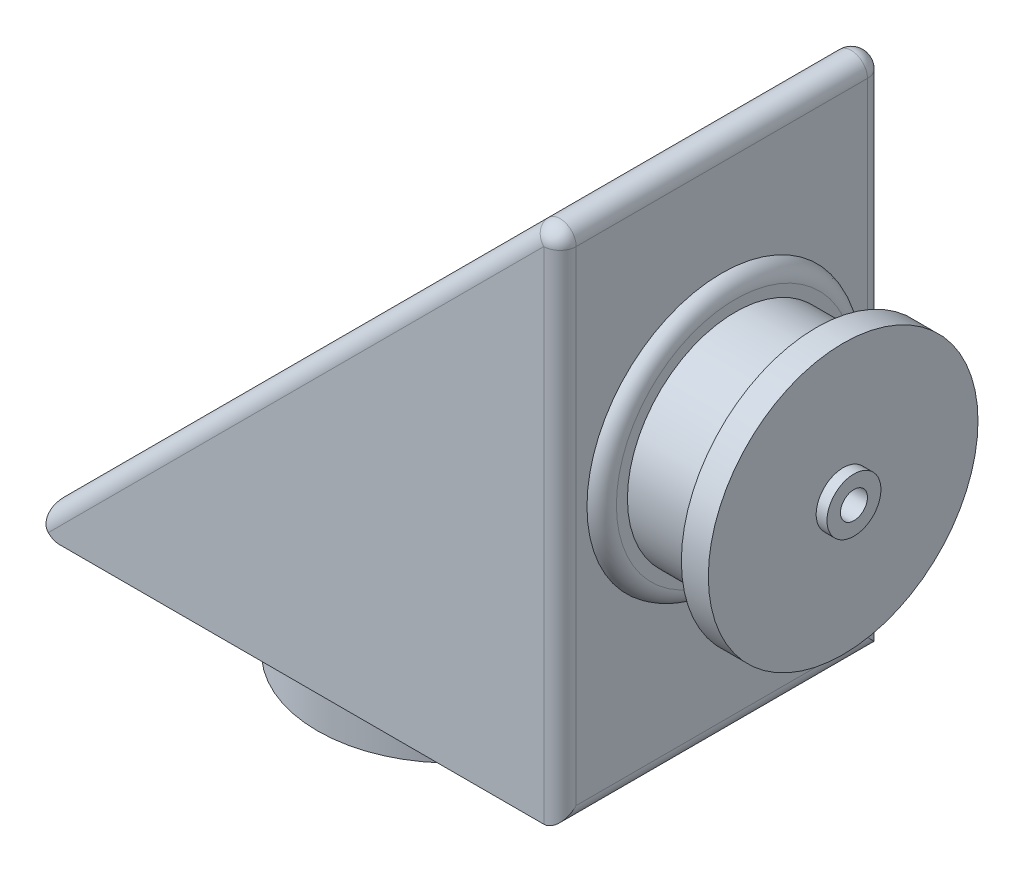
ISO-10303-21;
HEADER;
FILE_DESCRIPTION(('STEP AP214'),'2;1');
FILE_NAME('part.step','',(''),(''),'','','');
FILE_SCHEMA(('AUTOMOTIVE_DESIGN { 1 0 10303 214 1 1 1 1 }'));
ENDSEC;
DATA;
#1=APPLICATION_CONTEXT('core data for automotive mechanical design processes');
#2=APPLICATION_PROTOCOL_DEFINITION('international standard','automotive_design',2000,#1);
#3=PRODUCT_CONTEXT('',#1,'mechanical');
#4=PRODUCT('Part','Part','',(#3));
#5=PRODUCT_RELATED_PRODUCT_CATEGORY('part','',(#4));
#6=PRODUCT_DEFINITION_FORMATION('','',#4);
#7=PRODUCT_DEFINITION_CONTEXT('part definition',#1,'design');
#8=PRODUCT_DEFINITION('design','',#6,#7);
#9=PRODUCT_DEFINITION_SHAPE('','',#8);
#10=(LENGTH_UNIT() NAMED_UNIT(*) SI_UNIT(.MILLI.,.METRE.));
#11=(NAMED_UNIT(*) PLANE_ANGLE_UNIT() SI_UNIT($,.RADIAN.));
#12=(NAMED_UNIT(*) SI_UNIT($,.STERADIAN.) SOLID_ANGLE_UNIT());
#13=UNCERTAINTY_MEASURE_WITH_UNIT(LENGTH_MEASURE(1.E-05),#10,'distance_accuracy_value','');
#14=(GEOMETRIC_REPRESENTATION_CONTEXT(3) GLOBAL_UNCERTAINTY_ASSIGNED_CONTEXT((#13)) GLOBAL_UNIT_ASSIGNED_CONTEXT((#10,
#11,#12)) REPRESENTATION_CONTEXT('',''));
#15=CARTESIAN_POINT('',(0.,0.,0.));
#16=DIRECTION('',(0.,0.,1.));
#17=DIRECTION('',(1.,0.,0.));
#18=AXIS2_PLACEMENT_3D('',#15,#16,#17);
#19=CARTESIAN_POINT('',(100.,100.,30.));
#20=DIRECTION('',(0.707106781186547,-0.707106781186547,0.));
#21=DIRECTION('',(0.707106781186548,0.707106781186548,0.));
#22=AXIS2_PLACEMENT_3D('',#19,#20,#21);
#23=PLANE('',#22);
#24=DIRECTION('',(0.,0.,-1.));
#25=VECTOR('',#24,1.);
#26=CARTESIAN_POINT('',(94.8786796564404,94.8786796564404,30.));
#27=LINE('',#26,#25);
#28=CARTESIAN_POINT('',(94.8786796564404,94.8786796564404,27.));
#29=VERTEX_POINT('',#28);
#30=CARTESIAN_POINT('',(94.8786796564404,94.8786796564404,-27.));
#31=VERTEX_POINT('',#30);
#32=EDGE_CURVE('E258',#29,#31,#27,.T.);
#33=ORIENTED_EDGE('',*,*,#32,.T.);
#34=DIRECTION('',(-0.707106781186548,-0.707106781186548,0.));
#35=VECTOR('',#34,1.);
#36=CARTESIAN_POINT('',(100.,100.,-27.));
#37=LINE('',#36,#35);
#38=CARTESIAN_POINT('',(5.12132034355965,5.12132034355965,-27.));
#39=VERTEX_POINT('',#38);
#40=EDGE_CURVE('E65',#31,#39,#37,.T.);
#41=ORIENTED_EDGE('',*,*,#40,.T.);
#42=DIRECTION('',(0.,0.,-1.));
#43=VECTOR('',#42,1.);
#44=CARTESIAN_POINT('',(5.12132034355965,5.12132034355965,30.));
#45=LINE('',#44,#43);
#46=CARTESIAN_POINT('',(5.12132034355965,5.12132034355965,27.));
#47=VERTEX_POINT('',#46);
#48=EDGE_CURVE('E256',#39,#47,#45,.F.);
#49=ORIENTED_EDGE('',*,*,#48,.T.);
#50=DIRECTION('',(-0.707106781186548,-0.707106781186548,0.));
#51=VECTOR('',#50,1.);
#52=CARTESIAN_POINT('',(100.,100.,27.));
#53=LINE('',#52,#51);
#54=EDGE_CURVE('E254',#47,#29,#53,.F.);
#55=ORIENTED_EDGE('',*,*,#54,.T.);
#56=EDGE_LOOP('',(#33,#41,#49,#55));
#57=FACE_BOUND('',#56,.T.);
#58=ADVANCED_FACE('F41',(#57),#23,.F.);
#59=CARTESIAN_POINT('',(0.,0.,30.));
#60=DIRECTION('',(0.,1.,0.));
#61=DIRECTION('',(0.,0.,1.));
#62=AXIS2_PLACEMENT_3D('',#59,#60,#61);
#63=PLANE('',#62);
#64=CARTESIAN_POINT('',(50.,0.,0.));
#65=DIRECTION('',(0.,1.,0.));
#66=DIRECTION('',(0.,0.,1.));
#67=AXIS2_PLACEMENT_3D('',#64,#65,#66);
#68=CIRCLE('',#67,25.);
#69=CARTESIAN_POINT('',(50.,0.,25.));
#70=VERTEX_POINT('',#69);
#71=EDGE_CURVE('E158',#70,#70,#68,.F.);
#72=ORIENTED_EDGE('',*,*,#71,.F.);
#73=EDGE_LOOP('',(#72));
#74=FACE_BOUND('',#73,.T.);
#75=DIRECTION('',(1.,0.,0.));
#76=VECTOR('',#75,1.);
#77=CARTESIAN_POINT('',(0.,0.,-30.));
#78=LINE('',#77,#76);
#79=CARTESIAN_POINT('',(7.2426406871193,0.,-30.));
#80=VERTEX_POINT('',#79);
#81=CARTESIAN_POINT('',(97.,0.,-30.));
#82=VERTEX_POINT('',#81);
#83=EDGE_CURVE('E157',#80,#82,#78,.T.);
#84=ORIENTED_EDGE('',*,*,#83,.T.);
#85=DIRECTION('',(0.,0.,-1.));
#86=VECTOR('',#85,1.);
#87=CARTESIAN_POINT('',(97.,0.,30.));
#88=LINE('',#87,#86);
#89=CARTESIAN_POINT('',(97.,0.,30.));
#90=VERTEX_POINT('',#89);
#91=EDGE_CURVE('E239',#82,#90,#88,.F.);
#92=ORIENTED_EDGE('',*,*,#91,.T.);
#93=DIRECTION('',(1.,0.,0.));
#94=VECTOR('',#93,1.);
#95=CARTESIAN_POINT('',(0.,0.,30.));
#96=LINE('',#95,#94);
#97=CARTESIAN_POINT('',(7.2426406871193,0.,30.));
#98=VERTEX_POINT('',#97);
#99=EDGE_CURVE('E129',#98,#90,#96,.T.);
#100=ORIENTED_EDGE('',*,*,#99,.F.);
#101=DIRECTION('',(0.,0.,-1.));
#102=VECTOR('',#101,1.);
#103=CARTESIAN_POINT('',(7.2426406871193,0.,30.));
#104=LINE('',#103,#102);
#105=EDGE_CURVE('E230',#98,#80,#104,.T.);
#106=ORIENTED_EDGE('',*,*,#105,.T.);
#107=EDGE_LOOP('',(#84,#92,#100,#106));
#108=FACE_BOUND('',#107,.T.);
#109=ADVANCED_FACE('F182',(#74,#108),#63,.F.);
#110=CARTESIAN_POINT('',(100.,0.,30.));
#111=DIRECTION('',(-1.,0.,0.));
#112=DIRECTION('',(0.,0.,1.));
#113=AXIS2_PLACEMENT_3D('',#110,#111,#112);
#114=PLANE('',#113);
#115=CARTESIAN_POINT('',(100.,50.,0.));
#116=DIRECTION('',(-1.,0.,0.));
#117=DIRECTION('',(0.,0.,1.));
#118=AXIS2_PLACEMENT_3D('',#115,#116,#117);
#119=CIRCLE('',#118,25.);
#120=CARTESIAN_POINT('',(100.,50.,25.));
#121=VERTEX_POINT('',#120);
#122=EDGE_CURVE('E160',#121,#121,#119,.F.);
#123=ORIENTED_EDGE('',*,*,#122,.F.);
#124=EDGE_LOOP('',(#123));
#125=FACE_BOUND('',#124,.T.);
#126=DIRECTION('',(0.,1.,0.));
#127=VECTOR('',#126,1.);
#128=CARTESIAN_POINT('',(100.,0.,27.));
#129=LINE('',#128,#127);
#130=CARTESIAN_POINT('',(100.,92.7573593128807,27.));
#131=VERTEX_POINT('',#130);
#132=CARTESIAN_POINT('',(100.,3.,27.));
#133=VERTEX_POINT('',#132);
#134=EDGE_CURVE('E120',#131,#133,#129,.F.);
#135=ORIENTED_EDGE('',*,*,#134,.T.);
#136=DIRECTION('',(0.,0.,-1.));
#137=VECTOR('',#136,1.);
#138=CARTESIAN_POINT('',(100.,3.,30.));
#139=LINE('',#138,#137);
#140=CARTESIAN_POINT('',(100.,3.,-27.));
#141=VERTEX_POINT('',#140);
#142=EDGE_CURVE('E116',#133,#141,#139,.T.);
#143=ORIENTED_EDGE('',*,*,#142,.T.);
#144=DIRECTION('',(0.,1.,0.));
#145=VECTOR('',#144,1.);
#146=CARTESIAN_POINT('',(100.,0.,-27.));
#147=LINE('',#146,#145);
#148=CARTESIAN_POINT('',(100.,92.7573593128807,-27.));
#149=VERTEX_POINT('',#148);
#150=EDGE_CURVE('E110',#141,#149,#147,.T.);
#151=ORIENTED_EDGE('',*,*,#150,.T.);
#152=DIRECTION('',(0.,0.,-1.));
#153=VECTOR('',#152,1.);
#154=CARTESIAN_POINT('',(100.,92.7573593128807,30.));
#155=LINE('',#154,#153);
#156=EDGE_CURVE('E113',#149,#131,#155,.F.);
#157=ORIENTED_EDGE('',*,*,#156,.T.);
#158=EDGE_LOOP('',(#135,#143,#151,#157));
#159=FACE_BOUND('',#158,.T.);
#160=ADVANCED_FACE('F112',(#125,#159),#114,.F.);
#161=CARTESIAN_POINT('',(0.,0.,30.));
#162=DIRECTION('',(0.,0.,1.));
#163=DIRECTION('',(1.,0.,0.));
#164=AXIS2_PLACEMENT_3D('',#161,#162,#163);
#165=PLANE('',#164);
#166=ORIENTED_EDGE('',*,*,#99,.T.);
#167=DIRECTION('',(0.,1.,0.));
#168=VECTOR('',#167,1.);
#169=CARTESIAN_POINT('',(97.,100.,30.));
#170=LINE('',#169,#168);
#171=CARTESIAN_POINT('',(97.,92.7573593128807,30.));
#172=VERTEX_POINT('',#171);
#173=EDGE_CURVE('E252',#90,#172,#170,.T.);
#174=ORIENTED_EDGE('',*,*,#173,.T.);
#175=DIRECTION('',(-0.707106781186548,-0.707106781186548,0.));
#176=VECTOR('',#175,1.);
#177=CARTESIAN_POINT('',(2.12132034355964,-2.12132034355964,30.));
#178=LINE('',#177,#176);
#179=CARTESIAN_POINT('',(5.12132034355965,0.878679656440363,30.));
#180=VERTEX_POINT('',#179);
#181=EDGE_CURVE('E249',#172,#180,#178,.T.);
#182=ORIENTED_EDGE('',*,*,#181,.T.);
#183=CARTESIAN_POINT('',(7.2426406871193,3.,30.));
#184=DIRECTION('',(0.,0.,1.));
#185=DIRECTION('',(1.,0.,0.));
#186=AXIS2_PLACEMENT_3D('',#183,#184,#185);
#187=CIRCLE('',#186,3.);
#188=EDGE_CURVE('E232',#180,#98,#187,.T.);
#189=ORIENTED_EDGE('',*,*,#188,.T.);
#190=EDGE_LOOP('',(#166,#174,#182,#189));
#191=FACE_BOUND('',#190,.T.);
#192=ADVANCED_FACE('F224',(#191),#165,.T.);
#193=CARTESIAN_POINT('',(0.,0.,-30.));
#194=DIRECTION('',(0.,0.,1.));
#195=DIRECTION('',(1.,0.,0.));
#196=AXIS2_PLACEMENT_3D('',#193,#194,#195);
#197=PLANE('',#196);
#198=DIRECTION('',(-0.707106781186548,-0.707106781186548,0.));
#199=VECTOR('',#198,1.);
#200=CARTESIAN_POINT('',(2.12132034355965,-2.12132034355965,-30.));
#201=LINE('',#200,#199);
#202=CARTESIAN_POINT('',(5.12132034355966,0.878679656440354,-30.));
#203=VERTEX_POINT('',#202);
#204=CARTESIAN_POINT('',(97.,92.7573593128807,-30.));
#205=VERTEX_POINT('',#204);
#206=EDGE_CURVE('E242',#203,#205,#201,.F.);
#207=ORIENTED_EDGE('',*,*,#206,.T.);
#208=DIRECTION('',(0.,1.,0.));
#209=VECTOR('',#208,1.);
#210=CARTESIAN_POINT('',(97.,0.,-30.));
#211=LINE('',#210,#209);
#212=EDGE_CURVE('E136',#205,#82,#211,.F.);
#213=ORIENTED_EDGE('',*,*,#212,.T.);
#214=ORIENTED_EDGE('',*,*,#83,.F.);
#215=CARTESIAN_POINT('',(7.2426406871193,3.,-30.));
#216=DIRECTION('',(0.,0.,1.));
#217=DIRECTION('',(1.,0.,0.));
#218=AXIS2_PLACEMENT_3D('',#215,#216,#217);
#219=CIRCLE('',#218,3.);
#220=EDGE_CURVE('E234',#80,#203,#219,.F.);
#221=ORIENTED_EDGE('',*,*,#220,.T.);
#222=EDGE_LOOP('',(#207,#213,#214,#221));
#223=FACE_BOUND('',#222,.T.);
#224=ADVANCED_FACE('F219',(#223),#197,.F.);
#225=CARTESIAN_POINT('',(7.2426406871193,3.,30.));
#226=DIRECTION('',(0.,0.,-1.));
#227=DIRECTION('',(-1.,0.,0.));
#228=AXIS2_PLACEMENT_3D('',#225,#226,#227);
#229=CYLINDRICAL_SURFACE('',#228,3.);
#230=ORIENTED_EDGE('',*,*,#105,.F.);
#231=ORIENTED_EDGE('',*,*,#188,.F.);
#232=CARTESIAN_POINT('',(7.2426406871193,3.,27.));
#233=DIRECTION('',(0.5,0.5,0.707106781186547));
#234=DIRECTION('',(0.5,0.5,-0.707106781186547));
#235=AXIS2_PLACEMENT_3D('',#232,#233,#234);
#236=ELLIPSE('',#235,4.24264068711928,3.);
#237=EDGE_CURVE('E154',#47,#180,#236,.T.);
#238=ORIENTED_EDGE('',*,*,#237,.F.);
#239=ORIENTED_EDGE('',*,*,#48,.F.);
#240=CARTESIAN_POINT('',(7.2426406871193,3.,-27.));
#241=DIRECTION('',(-0.5,-0.5,0.707106781186547));
#242=DIRECTION('',(-0.5,-0.5,-0.707106781186547));
#243=AXIS2_PLACEMENT_3D('',#240,#241,#242);
#244=ELLIPSE('',#243,4.24264068711928,3.);
#245=EDGE_CURVE('E151',#203,#39,#244,.F.);
#246=ORIENTED_EDGE('',*,*,#245,.F.);
#247=ORIENTED_EDGE('',*,*,#220,.F.);
#248=EDGE_LOOP('',(#230,#231,#238,#239,#246,#247));
#249=FACE_BOUND('',#248,.T.);
#250=ADVANCED_FACE('F216',(#249),#229,.T.);
#251=CARTESIAN_POINT('',(2.12132034355964,-2.12132034355964,27.));
#252=DIRECTION('',(0.707106781186548,0.707106781186548,0.));
#253=DIRECTION('',(-0.707106781186548,0.707106781186548,0.));
#254=AXIS2_PLACEMENT_3D('',#251,#252,#253);
#255=CYLINDRICAL_SURFACE('',#254,3.);
#256=ORIENTED_EDGE('',*,*,#237,.T.);
#257=ORIENTED_EDGE('',*,*,#181,.F.);
#258=CARTESIAN_POINT('',(97.,92.7573593128807,27.));
#259=DIRECTION('',(0.707106781186548,0.707106781186548,0.));
#260=DIRECTION('',(-0.707106781186548,0.707106781186548,0.));
#261=AXIS2_PLACEMENT_3D('',#258,#259,#260);
#262=CIRCLE('',#261,3.);
#263=EDGE_CURVE('E148',#29,#172,#262,.T.);
#264=ORIENTED_EDGE('',*,*,#263,.F.);
#265=ORIENTED_EDGE('',*,*,#54,.F.);
#266=EDGE_LOOP('',(#256,#257,#264,#265));
#267=FACE_BOUND('',#266,.T.);
#268=ADVANCED_FACE('F214',(#267),#255,.T.);
#269=CARTESIAN_POINT('',(97.,92.7573593128807,30.));
#270=DIRECTION('',(0.,0.,-1.));
#271=DIRECTION('',(-1.,0.,0.));
#272=AXIS2_PLACEMENT_3D('',#269,#270,#271);
#273=CYLINDRICAL_SURFACE('',#272,3.);
#274=CARTESIAN_POINT('',(97.,92.7573593128807,-27.));
#275=DIRECTION('',(0.,0.,-1.));
#276=DIRECTION('',(-1.,0.,0.));
#277=AXIS2_PLACEMENT_3D('',#274,#275,#276);
#278=CIRCLE('',#277,3.);
#279=EDGE_CURVE('E125',#31,#149,#278,.T.);
#280=ORIENTED_EDGE('',*,*,#279,.F.);
#281=ORIENTED_EDGE('',*,*,#32,.F.);
#282=CARTESIAN_POINT('',(97.,92.7573593128807,27.));
#283=DIRECTION('',(0.,0.,1.));
#284=DIRECTION('',(1.,0.,0.));
#285=AXIS2_PLACEMENT_3D('',#282,#283,#284);
#286=CIRCLE('',#285,3.);
#287=EDGE_CURVE('E127',#131,#29,#286,.T.);
#288=ORIENTED_EDGE('',*,*,#287,.F.);
#289=ORIENTED_EDGE('',*,*,#156,.F.);
#290=EDGE_LOOP('',(#280,#281,#288,#289));
#291=FACE_BOUND('',#290,.T.);
#292=ADVANCED_FACE('F123',(#291),#273,.T.);
#293=CARTESIAN_POINT('',(102.12132034356,97.8786796564404,-27.));
#294=DIRECTION('',(-0.707106781186548,-0.707106781186548,0.));
#295=DIRECTION('',(0.707106781186548,-0.707106781186548,0.));
#296=AXIS2_PLACEMENT_3D('',#293,#294,#295);
#297=CYLINDRICAL_SURFACE('',#296,3.);
#298=ORIENTED_EDGE('',*,*,#245,.T.);
#299=ORIENTED_EDGE('',*,*,#40,.F.);
#300=CARTESIAN_POINT('',(97.,92.7573593128807,-27.));
#301=DIRECTION('',(0.707106781186548,0.707106781186548,0.));
#302=DIRECTION('',(-0.707106781186548,0.707106781186548,0.));
#303=AXIS2_PLACEMENT_3D('',#300,#301,#302);
#304=CIRCLE('',#303,3.);
#305=EDGE_CURVE('E57',#205,#31,#304,.T.);
#306=ORIENTED_EDGE('',*,*,#305,.F.);
#307=ORIENTED_EDGE('',*,*,#206,.F.);
#308=EDGE_LOOP('',(#298,#299,#306,#307));
#309=FACE_BOUND('',#308,.T.);
#310=ADVANCED_FACE('F207',(#309),#297,.T.);
#311=CARTESIAN_POINT('',(97.,92.7573593128807,27.));
#312=DIRECTION('',(0.,0.,1.));
#313=DIRECTION('',(0.,-1.,0.));
#314=AXIS2_PLACEMENT_3D('',#311,#312,#313);
#315=SPHERICAL_SURFACE('',#314,3.);
#316=ORIENTED_EDGE('',*,*,#287,.T.);
#317=ORIENTED_EDGE('',*,*,#263,.T.);
#318=CARTESIAN_POINT('',(97.,92.7573593128807,27.));
#319=DIRECTION('',(0.,1.,0.));
#320=DIRECTION('',(-1.,0.,0.));
#321=AXIS2_PLACEMENT_3D('',#318,#319,#320);
#322=CIRCLE('',#321,3.);
#323=EDGE_CURVE('E137',#131,#172,#322,.F.);
#324=ORIENTED_EDGE('',*,*,#323,.F.);
#325=EDGE_LOOP('',(#316,#317,#324));
#326=FACE_BOUND('',#325,.T.);
#327=ADVANCED_FACE('F204',(#326),#315,.T.);
#328=CARTESIAN_POINT('',(97.,92.7573593128807,-27.));
#329=DIRECTION('',(0.,0.,-1.));
#330=DIRECTION('',(-1.,0.,0.));
#331=AXIS2_PLACEMENT_3D('',#328,#329,#330);
#332=SPHERICAL_SURFACE('',#331,3.);
#333=ORIENTED_EDGE('',*,*,#305,.T.);
#334=ORIENTED_EDGE('',*,*,#279,.T.);
#335=CARTESIAN_POINT('',(97.,92.7573593128807,-27.));
#336=DIRECTION('',(0.,1.,0.));
#337=DIRECTION('',(0.,0.,1.));
#338=AXIS2_PLACEMENT_3D('',#335,#336,#337);
#339=CIRCLE('',#338,3.);
#340=EDGE_CURVE('E132',#205,#149,#339,.F.);
#341=ORIENTED_EDGE('',*,*,#340,.F.);
#342=EDGE_LOOP('',(#333,#334,#341));
#343=FACE_BOUND('',#342,.T.);
#344=ADVANCED_FACE('F131',(#343),#332,.T.);
#345=CARTESIAN_POINT('',(97.,0.,27.));
#346=DIRECTION('',(0.,-1.,0.));
#347=DIRECTION('',(0.,0.,-1.));
#348=AXIS2_PLACEMENT_3D('',#345,#346,#347);
#349=CYLINDRICAL_SURFACE('',#348,3.);
#350=ORIENTED_EDGE('',*,*,#323,.T.);
#351=ORIENTED_EDGE('',*,*,#173,.F.);
#352=CARTESIAN_POINT('',(97.,3.,27.));
#353=DIRECTION('',(0.,-0.707106781186547,-0.707106781186547));
#354=DIRECTION('',(0.,-0.707106781186547,0.707106781186547));
#355=AXIS2_PLACEMENT_3D('',#352,#353,#354);
#356=ELLIPSE('',#355,4.24264068711928,3.);
#357=EDGE_CURVE('E138',#133,#90,#356,.T.);
#358=ORIENTED_EDGE('',*,*,#357,.F.);
#359=ORIENTED_EDGE('',*,*,#134,.F.);
#360=EDGE_LOOP('',(#350,#351,#358,#359));
#361=FACE_BOUND('',#360,.T.);
#362=ADVANCED_FACE('F198',(#361),#349,.T.);
#363=CARTESIAN_POINT('',(97.,0.,-27.));
#364=DIRECTION('',(0.,1.,0.));
#365=DIRECTION('',(0.,0.,1.));
#366=AXIS2_PLACEMENT_3D('',#363,#364,#365);
#367=CYLINDRICAL_SURFACE('',#366,3.);
#368=ORIENTED_EDGE('',*,*,#340,.T.);
#369=ORIENTED_EDGE('',*,*,#150,.F.);
#370=CARTESIAN_POINT('',(97.,3.,-27.));
#371=DIRECTION('',(0.,0.707106781186547,-0.707106781186547));
#372=DIRECTION('',(0.,0.707106781186547,0.707106781186547));
#373=AXIS2_PLACEMENT_3D('',#370,#371,#372);
#374=ELLIPSE('',#373,4.24264068711928,3.);
#375=EDGE_CURVE('E142',#82,#141,#374,.F.);
#376=ORIENTED_EDGE('',*,*,#375,.F.);
#377=ORIENTED_EDGE('',*,*,#212,.F.);
#378=EDGE_LOOP('',(#368,#369,#376,#377));
#379=FACE_BOUND('',#378,.T.);
#380=ADVANCED_FACE('F135',(#379),#367,.T.);
#381=CARTESIAN_POINT('',(97.,3.,30.));
#382=DIRECTION('',(0.,0.,-1.));
#383=DIRECTION('',(-1.,0.,0.));
#384=AXIS2_PLACEMENT_3D('',#381,#382,#383);
#385=CYLINDRICAL_SURFACE('',#384,3.);
#386=ORIENTED_EDGE('',*,*,#357,.T.);
#387=ORIENTED_EDGE('',*,*,#91,.F.);
#388=ORIENTED_EDGE('',*,*,#375,.T.);
#389=ORIENTED_EDGE('',*,*,#142,.F.);
#390=EDGE_LOOP('',(#386,#387,#388,#389));
#391=FACE_BOUND('',#390,.T.);
#392=ADVANCED_FACE('F191',(#391),#385,.T.);
#393=CARTESIAN_POINT('',(50.,-11.,0.));
#394=DIRECTION('',(0.,1.,0.));
#395=DIRECTION('',(0.,0.,1.));
#396=AXIS2_PLACEMENT_3D('',#393,#394,#395);
#397=CYLINDRICAL_SURFACE('',#396,25.);
#398=CARTESIAN_POINT('',(50.,-11.,0.));
#399=DIRECTION('',(0.,-1.,0.));
#400=DIRECTION('',(0.,0.,-1.));
#401=AXIS2_PLACEMENT_3D('',#398,#399,#400);
#402=CIRCLE('',#401,25.);
#403=CARTESIAN_POINT('',(50.,-11.,-25.));
#404=VERTEX_POINT('',#403);
#405=EDGE_CURVE('E260',#404,#404,#402,.T.);
#406=ORIENTED_EDGE('',*,*,#405,.F.);
#407=EDGE_LOOP('',(#406));
#408=FACE_BOUND('',#407,.T.);
#409=ORIENTED_EDGE('',*,*,#71,.T.);
#410=EDGE_LOOP('',(#409));
#411=FACE_BOUND('',#410,.T.);
#412=ADVANCED_FACE('F194',(#408,#411),#397,.T.);
#413=CARTESIAN_POINT('',(50.,-11.,0.));
#414=DIRECTION('',(0.,-1.,0.));
#415=DIRECTION('',(0.,0.,-1.));
#416=AXIS2_PLACEMENT_3D('',#413,#414,#415);
#417=PLANE('',#416);
#418=ORIENTED_EDGE('',*,*,#405,.T.);
#419=EDGE_LOOP('',(#418));
#420=FACE_BOUND('',#419,.T.);
#421=ADVANCED_FACE('F178',(#420),#417,.T.);
#422=CARTESIAN_POINT('',(102.5,50.,0.));
#423=DIRECTION('',(1.,0.,0.));
#424=DIRECTION('',(0.,0.,-1.));
#425=AXIS2_PLACEMENT_3D('',#422,#423,#424);
#426=PLANE('',#425);
#427=CARTESIAN_POINT('',(102.5,50.,0.));
#428=DIRECTION('',(1.,0.,0.));
#429=DIRECTION('',(0.,0.,-1.));
#430=AXIS2_PLACEMENT_3D('',#427,#428,#429);
#431=CIRCLE('',#430,20.);
#432=CARTESIAN_POINT('',(102.5,50.,-20.));
#433=VERTEX_POINT('',#432);
#434=EDGE_CURVE('E268',#433,#433,#431,.T.);
#435=ORIENTED_EDGE('',*,*,#434,.F.);
#436=EDGE_LOOP('',(#435));
#437=FACE_BOUND('',#436,.T.);
#438=CARTESIAN_POINT('',(102.5,50.,0.));
#439=DIRECTION('',(1.,0.,0.));
#440=DIRECTION('',(0.,0.,-1.));
#441=AXIS2_PLACEMENT_3D('',#438,#439,#440);
#442=CIRCLE('',#441,22.0419601084502);
#443=CARTESIAN_POINT('',(102.5,50.,-22.0419601084502));
#444=VERTEX_POINT('',#443);
#445=EDGE_CURVE('E45',#444,#444,#442,.T.);
#446=ORIENTED_EDGE('',*,*,#445,.T.);
#447=EDGE_LOOP('',(#446));
#448=FACE_BOUND('',#447,.T.);
#449=ADVANCED_FACE('F167',(#437,#448),#426,.T.);
#450=CARTESIAN_POINT('',(99.5,50.,0.));
#451=DIRECTION('',(-1.,0.,0.));
#452=DIRECTION('',(0.,0.,1.));
#453=AXIS2_PLACEMENT_3D('',#450,#451,#452);
#454=TOROIDAL_SURFACE('',#453,22.0419601084502,3.);
#455=ORIENTED_EDGE('',*,*,#122,.T.);
#456=EDGE_LOOP('',(#455));
#457=FACE_BOUND('',#456,.T.);
#458=ORIENTED_EDGE('',*,*,#445,.F.);
#459=EDGE_LOOP('',(#458));
#460=FACE_BOUND('',#459,.T.);
#461=ADVANCED_FACE('F43',(#457,#460),#454,.T.);
#462=CARTESIAN_POINT('',(117.5,50.,0.));
#463=DIRECTION('',(-1.,0.,0.));
#464=DIRECTION('',(0.,0.,1.));
#465=AXIS2_PLACEMENT_3D('',#462,#463,#464);
#466=CYLINDRICAL_SURFACE('',#465,20.);
#467=CARTESIAN_POINT('',(117.5,50.,0.));
#468=DIRECTION('',(1.,0.,0.));
#469=DIRECTION('',(0.,0.,-1.));
#470=AXIS2_PLACEMENT_3D('',#467,#468,#469);
#471=CIRCLE('',#470,20.);
#472=CARTESIAN_POINT('',(117.5,50.,-20.));
#473=VERTEX_POINT('',#472);
#474=EDGE_CURVE('E263',#473,#473,#471,.T.);
#475=ORIENTED_EDGE('',*,*,#474,.F.);
#476=EDGE_LOOP('',(#475));
#477=FACE_BOUND('',#476,.T.);
#478=ORIENTED_EDGE('',*,*,#434,.T.);
#479=EDGE_LOOP('',(#478));
#480=FACE_BOUND('',#479,.T.);
#481=ADVANCED_FACE('F170',(#477,#480),#466,.T.);
#482=CARTESIAN_POINT('',(122.5,50.,0.));
#483=DIRECTION('',(-1.,0.,0.));
#484=DIRECTION('',(0.,0.,1.));
#485=AXIS2_PLACEMENT_3D('',#482,#483,#484);
#486=CYLINDRICAL_SURFACE('',#485,25.);
#487=CARTESIAN_POINT('',(122.5,50.,0.));
#488=DIRECTION('',(1.,0.,0.));
#489=DIRECTION('',(0.,0.,-1.));
#490=AXIS2_PLACEMENT_3D('',#487,#488,#489);
#491=CIRCLE('',#490,25.);
#492=CARTESIAN_POINT('',(122.5,50.,-25.));
#493=VERTEX_POINT('',#492);
#494=EDGE_CURVE('E335',#493,#493,#491,.T.);
#495=ORIENTED_EDGE('',*,*,#494,.F.);
#496=EDGE_LOOP('',(#495));
#497=FACE_BOUND('',#496,.T.);
#498=CARTESIAN_POINT('',(117.5,50.,0.));
#499=DIRECTION('',(1.,0.,0.));
#500=DIRECTION('',(0.,0.,-1.));
#501=AXIS2_PLACEMENT_3D('',#498,#499,#500);
#502=CIRCLE('',#501,25.);
#503=CARTESIAN_POINT('',(117.5,50.,-25.));
#504=VERTEX_POINT('',#503);
#505=EDGE_CURVE('E330',#504,#504,#502,.T.);
#506=ORIENTED_EDGE('',*,*,#505,.T.);
#507=EDGE_LOOP('',(#506));
#508=FACE_BOUND('',#507,.T.);
#509=ADVANCED_FACE('F175',(#497,#508),#486,.T.);
#510=CARTESIAN_POINT('',(122.5,50.,0.));
#511=DIRECTION('',(1.,0.,0.));
#512=DIRECTION('',(0.,0.,-1.));
#513=AXIS2_PLACEMENT_3D('',#510,#511,#512);
#514=PLANE('',#513);
#515=CARTESIAN_POINT('',(122.5,50.,0.));
#516=DIRECTION('',(1.,0.,0.));
#517=DIRECTION('',(0.,0.,-1.));
#518=AXIS2_PLACEMENT_3D('',#515,#516,#517);
#519=CIRCLE('',#518,5.);
#520=CARTESIAN_POINT('',(122.5,50.,-5.));
#521=VERTEX_POINT('',#520);
#522=EDGE_CURVE('E12',#521,#521,#519,.T.);
#523=ORIENTED_EDGE('',*,*,#522,.F.);
#524=EDGE_LOOP('',(#523));
#525=FACE_BOUND('',#524,.T.);
#526=ORIENTED_EDGE('',*,*,#494,.T.);
#527=EDGE_LOOP('',(#526));
#528=FACE_BOUND('',#527,.T.);
#529=ADVANCED_FACE('F297',(#525,#528),#514,.T.);
#530=CARTESIAN_POINT('',(117.5,50.,0.));
#531=DIRECTION('',(1.,0.,0.));
#532=DIRECTION('',(0.,0.,-1.));
#533=AXIS2_PLACEMENT_3D('',#530,#531,#532);
#534=PLANE('',#533);
#535=ORIENTED_EDGE('',*,*,#474,.T.);
#536=EDGE_LOOP('',(#535));
#537=FACE_BOUND('',#536,.T.);
#538=ORIENTED_EDGE('',*,*,#505,.F.);
#539=EDGE_LOOP('',(#538));
#540=FACE_BOUND('',#539,.T.);
#541=ADVANCED_FACE('F299',(#537,#540),#534,.F.);
#542=CARTESIAN_POINT('',(124.5,50.,0.));
#543=DIRECTION('',(-1.,0.,0.));
#544=DIRECTION('',(0.,0.,1.));
#545=AXIS2_PLACEMENT_3D('',#542,#543,#544);
#546=CYLINDRICAL_SURFACE('',#545,5.);
#547=CARTESIAN_POINT('',(124.5,50.,0.));
#548=DIRECTION('',(1.,0.,0.));
#549=DIRECTION('',(0.,0.,-1.));
#550=AXIS2_PLACEMENT_3D('',#547,#548,#549);
#551=CIRCLE('',#550,5.);
#552=CARTESIAN_POINT('',(124.5,50.,-5.));
#553=VERTEX_POINT('',#552);
#554=EDGE_CURVE('E326',#553,#553,#551,.T.);
#555=ORIENTED_EDGE('',*,*,#554,.F.);
#556=EDGE_LOOP('',(#555));
#557=FACE_BOUND('',#556,.T.);
#558=ORIENTED_EDGE('',*,*,#522,.T.);
#559=EDGE_LOOP('',(#558));
#560=FACE_BOUND('',#559,.T.);
#561=ADVANCED_FACE('F302',(#557,#560),#546,.T.);
#562=CARTESIAN_POINT('',(124.5,50.,0.));
#563=DIRECTION('',(1.,0.,0.));
#564=DIRECTION('',(0.,0.,-1.));
#565=AXIS2_PLACEMENT_3D('',#562,#563,#564);
#566=PLANE('',#565);
#567=CARTESIAN_POINT('',(124.5,50.,0.));
#568=DIRECTION('',(1.,0.,0.));
#569=DIRECTION('',(0.,0.,-1.));
#570=AXIS2_PLACEMENT_3D('',#567,#568,#569);
#571=CIRCLE('',#570,2.5);
#572=CARTESIAN_POINT('',(124.5,50.,-2.5));
#573=VERTEX_POINT('',#572);
#574=EDGE_CURVE('E327',#573,#573,#571,.T.);
#575=ORIENTED_EDGE('',*,*,#574,.F.);
#576=EDGE_LOOP('',(#575));
#577=FACE_BOUND('',#576,.T.);
#578=ORIENTED_EDGE('',*,*,#554,.T.);
#579=EDGE_LOOP('',(#578));
#580=FACE_BOUND('',#579,.T.);
#581=ADVANCED_FACE('F309',(#577,#580),#566,.T.);
#582=CARTESIAN_POINT('',(114.5,50.,0.));
#583=DIRECTION('',(1.,0.,0.));
#584=DIRECTION('',(0.,0.,-1.));
#585=AXIS2_PLACEMENT_3D('',#582,#583,#584);
#586=CYLINDRICAL_SURFACE('',#585,2.5);
#587=CARTESIAN_POINT('',(114.5,50.,0.));
#588=DIRECTION('',(1.,0.,0.));
#589=DIRECTION('',(0.,0.,-1.));
#590=AXIS2_PLACEMENT_3D('',#587,#588,#589);
#591=CIRCLE('',#590,2.5);
#592=CARTESIAN_POINT('',(114.5,50.,-2.5));
#593=VERTEX_POINT('',#592);
#594=EDGE_CURVE('E325',#593,#593,#591,.T.);
#595=ORIENTED_EDGE('',*,*,#594,.F.);
#596=EDGE_LOOP('',(#595));
#597=FACE_BOUND('',#596,.T.);
#598=ORIENTED_EDGE('',*,*,#574,.T.);
#599=EDGE_LOOP('',(#598));
#600=FACE_BOUND('',#599,.T.);
#601=ADVANCED_FACE('F313',(#597,#600),#586,.F.);
#602=CARTESIAN_POINT('',(114.5,50.,0.));
#603=DIRECTION('',(1.,0.,0.));
#604=DIRECTION('',(0.,0.,-1.));
#605=AXIS2_PLACEMENT_3D('',#602,#603,#604);
#606=PLANE('',#605);
#607=ORIENTED_EDGE('',*,*,#594,.T.);
#608=EDGE_LOOP('',(#607));
#609=FACE_BOUND('',#608,.T.);
#610=ADVANCED_FACE('F317',(#609),#606,.T.);
#611=CLOSED_SHELL('',(#58,#109,#160,#192,#224,#250,#268,#292,#310,#327,#344,#362,#380,#392,#412,
#421,#449,#461,#481,#509,#529,#541,#561,#581,#601,#610));
#612=MANIFOLD_SOLID_BREP('B2',#611);
#613=ADVANCED_BREP_SHAPE_REPRESENTATION('',(#18,#612),#14);
#614=SHAPE_DEFINITION_REPRESENTATION(#9,#613);
ENDSEC;
END-ISO-10303-21;
